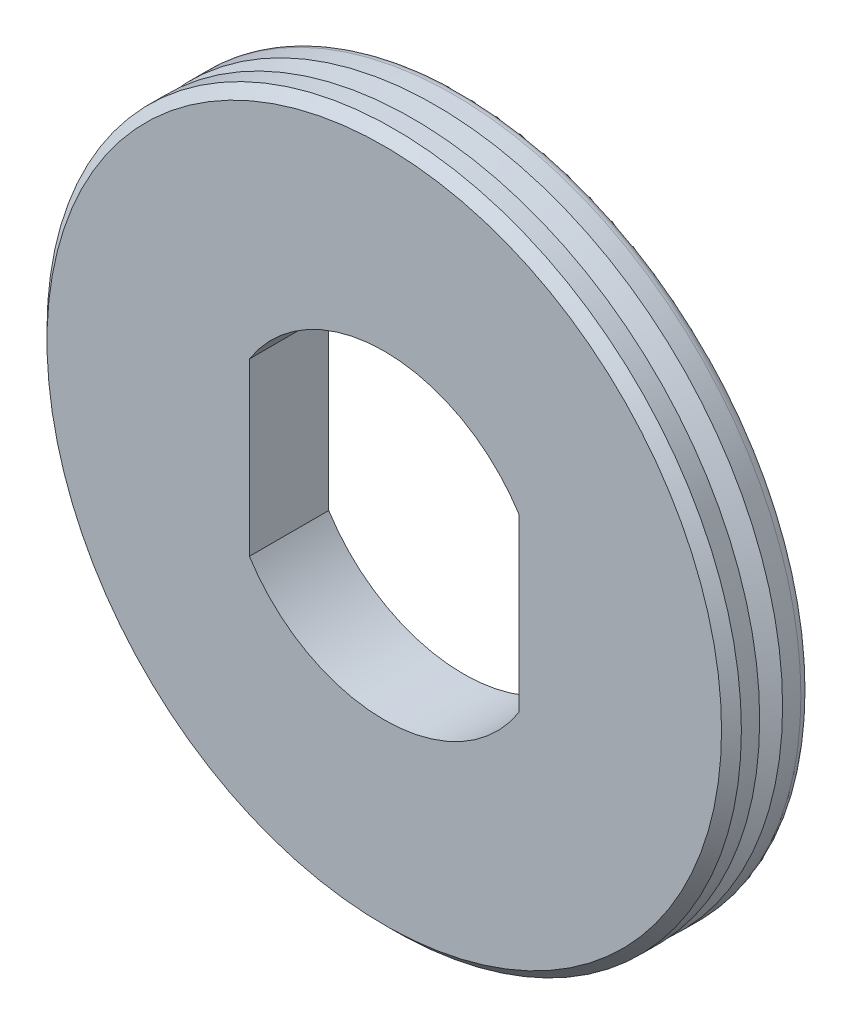
ISO-10303-21;
HEADER;
FILE_DESCRIPTION(('STEP AP214'),'2;1');
FILE_NAME('part.step','',(''),(''),'','','');
FILE_SCHEMA(('AUTOMOTIVE_DESIGN { 1 0 10303 214 1 1 1 1 }'));
ENDSEC;
DATA;
#1=APPLICATION_CONTEXT('core data for automotive mechanical design processes');
#2=APPLICATION_PROTOCOL_DEFINITION('international standard','automotive_design',2000,#1);
#3=PRODUCT_CONTEXT('',#1,'mechanical');
#4=PRODUCT('Part','Part','',(#3));
#5=PRODUCT_RELATED_PRODUCT_CATEGORY('part','',(#4));
#6=PRODUCT_DEFINITION_FORMATION('','',#4);
#7=PRODUCT_DEFINITION_CONTEXT('part definition',#1,'design');
#8=PRODUCT_DEFINITION('design','',#6,#7);
#9=PRODUCT_DEFINITION_SHAPE('','',#8);
#10=(LENGTH_UNIT() NAMED_UNIT(*) SI_UNIT(.MILLI.,.METRE.));
#11=(NAMED_UNIT(*) PLANE_ANGLE_UNIT() SI_UNIT($,.RADIAN.));
#12=(NAMED_UNIT(*) SI_UNIT($,.STERADIAN.) SOLID_ANGLE_UNIT());
#13=UNCERTAINTY_MEASURE_WITH_UNIT(LENGTH_MEASURE(1.E-05),#10,'distance_accuracy_value','');
#14=(GEOMETRIC_REPRESENTATION_CONTEXT(3) GLOBAL_UNCERTAINTY_ASSIGNED_CONTEXT((#13)) GLOBAL_UNIT_ASSIGNED_CONTEXT((#10,
#11,#12)) REPRESENTATION_CONTEXT('',''));
#15=CARTESIAN_POINT('',(0.,0.,0.));
#16=DIRECTION('',(0.,0.,1.));
#17=DIRECTION('',(1.,0.,0.));
#18=AXIS2_PLACEMENT_3D('',#15,#16,#17);
#19=CARTESIAN_POINT('',(0.,0.,2.));
#20=DIRECTION('',(0.,0.,-1.));
#21=DIRECTION('',(-1.,0.,0.));
#22=AXIS2_PLACEMENT_3D('',#19,#20,#21);
#23=CYLINDRICAL_SURFACE('',#22,17.5);
#24=CARTESIAN_POINT('',(0.,0.,1.5));
#25=DIRECTION('',(0.,0.,1.));
#26=DIRECTION('',(1.,0.,0.));
#27=AXIS2_PLACEMENT_3D('',#24,#25,#26);
#28=CIRCLE('',#27,17.5);
#29=CARTESIAN_POINT('',(17.5,0.,1.5));
#30=VERTEX_POINT('',#29);
#31=EDGE_CURVE('E118',#30,#30,#28,.F.);
#32=ORIENTED_EDGE('',*,*,#31,.T.);
#33=EDGE_LOOP('',(#32));
#34=FACE_BOUND('',#33,.T.);
#35=CARTESIAN_POINT('',(0.,0.,0.577350269189624));
#36=DIRECTION('',(0.,0.,1.));
#37=DIRECTION('',(1.,0.,0.));
#38=AXIS2_PLACEMENT_3D('',#35,#36,#37);
#39=CIRCLE('',#38,17.5);
#40=CARTESIAN_POINT('',(17.5,0.,0.577350269189624));
#41=VERTEX_POINT('',#40);
#42=EDGE_CURVE('E106',#41,#41,#39,.T.);
#43=ORIENTED_EDGE('',*,*,#42,.T.);
#44=EDGE_LOOP('',(#43));
#45=FACE_BOUND('',#44,.T.);
#46=ADVANCED_FACE('F36',(#34,#45),#23,.T.);
#47=CARTESIAN_POINT('',(0.,0.,-1.5));
#48=DIRECTION('',(0.,0.,1.));
#49=DIRECTION('',(1.,0.,0.));
#50=AXIS2_PLACEMENT_3D('',#47,#48,#49);
#51=CIRCLE('',#50,17.5);
#52=CARTESIAN_POINT('',(17.5,0.,-1.5));
#53=VERTEX_POINT('',#52);
#54=EDGE_CURVE('E44',#53,#53,#51,.T.);
#55=ORIENTED_EDGE('',*,*,#54,.T.);
#56=EDGE_LOOP('',(#55));
#57=FACE_BOUND('',#56,.T.);
#58=CARTESIAN_POINT('',(0.,0.,-0.577350269189624));
#59=DIRECTION('',(0.,0.,1.));
#60=DIRECTION('',(1.,0.,0.));
#61=AXIS2_PLACEMENT_3D('',#58,#59,#60);
#62=CIRCLE('',#61,17.5);
#63=CARTESIAN_POINT('',(17.5,0.,-0.577350269189624));
#64=VERTEX_POINT('',#63);
#65=EDGE_CURVE('E175',#64,#64,#62,.T.);
#66=ORIENTED_EDGE('',*,*,#65,.F.);
#67=EDGE_LOOP('',(#66));
#68=FACE_BOUND('',#67,.T.);
#69=ADVANCED_FACE('F123',(#57,#68),#23,.T.);
#70=CARTESIAN_POINT('',(0.,0.,2.));
#71=DIRECTION('',(0.,0.,1.));
#72=DIRECTION('',(1.,0.,0.));
#73=AXIS2_PLACEMENT_3D('',#70,#71,#72);
#74=PLANE('',#73);
#75=CARTESIAN_POINT('',(0.,0.,2.));
#76=DIRECTION('',(0.,0.,1.));
#77=DIRECTION('',(1.,0.,0.));
#78=AXIS2_PLACEMENT_3D('',#75,#76,#77);
#79=CIRCLE('',#78,17.);
#80=CARTESIAN_POINT('',(17.,0.,2.));
#81=VERTEX_POINT('',#80);
#82=EDGE_CURVE('E93',#81,#81,#79,.T.);
#83=ORIENTED_EDGE('',*,*,#82,.T.);
#84=EDGE_LOOP('',(#83));
#85=FACE_BOUND('',#84,.T.);
#86=DIRECTION('',(0.,-1.,0.));
#87=VECTOR('',#86,1.);
#88=CARTESIAN_POINT('',(-6.8,4.30842198490352,2.));
#89=LINE('',#88,#87);
#90=CARTESIAN_POINT('',(-6.8,4.30842198490352,2.));
#91=VERTEX_POINT('',#90);
#92=CARTESIAN_POINT('',(-6.8,-4.30842198490352,2.));
#93=VERTEX_POINT('',#92);
#94=EDGE_CURVE('E85',#91,#93,#89,.T.);
#95=ORIENTED_EDGE('',*,*,#94,.F.);
#96=CARTESIAN_POINT('',(0.,0.,2.));
#97=DIRECTION('',(0.,0.,1.));
#98=DIRECTION('',(1.,0.,0.));
#99=AXIS2_PLACEMENT_3D('',#96,#97,#98);
#100=CIRCLE('',#99,8.05);
#101=CARTESIAN_POINT('',(6.8,4.30842198490352,2.));
#102=VERTEX_POINT('',#101);
#103=EDGE_CURVE('E77',#102,#91,#100,.T.);
#104=ORIENTED_EDGE('',*,*,#103,.F.);
#105=DIRECTION('',(0.,1.,0.));
#106=VECTOR('',#105,1.);
#107=CARTESIAN_POINT('',(6.8,4.30842198490352,2.));
#108=LINE('',#107,#106);
#109=CARTESIAN_POINT('',(6.8,-4.30842198490352,2.));
#110=VERTEX_POINT('',#109);
#111=EDGE_CURVE('E100',#110,#102,#108,.T.);
#112=ORIENTED_EDGE('',*,*,#111,.F.);
#113=CARTESIAN_POINT('',(0.,0.,2.));
#114=DIRECTION('',(0.,0.,1.));
#115=DIRECTION('',(1.,0.,0.));
#116=AXIS2_PLACEMENT_3D('',#113,#114,#115);
#117=CIRCLE('',#116,8.05);
#118=EDGE_CURVE('E98',#93,#110,#117,.T.);
#119=ORIENTED_EDGE('',*,*,#118,.F.);
#120=EDGE_LOOP('',(#95,#104,#112,#119));
#121=FACE_BOUND('',#120,.T.);
#122=ADVANCED_FACE('F97',(#85,#121),#74,.T.);
#123=CARTESIAN_POINT('',(0.,0.,-2.));
#124=DIRECTION('',(0.,0.,1.));
#125=DIRECTION('',(1.,0.,0.));
#126=AXIS2_PLACEMENT_3D('',#123,#124,#125);
#127=PLANE('',#126);
#128=CARTESIAN_POINT('',(0.,0.,-2.));
#129=DIRECTION('',(0.,0.,1.));
#130=DIRECTION('',(1.,0.,0.));
#131=AXIS2_PLACEMENT_3D('',#128,#129,#130);
#132=CIRCLE('',#131,17.);
#133=CARTESIAN_POINT('',(17.,0.,-2.));
#134=VERTEX_POINT('',#133);
#135=EDGE_CURVE('E11',#134,#134,#132,.F.);
#136=ORIENTED_EDGE('',*,*,#135,.T.);
#137=EDGE_LOOP('',(#136));
#138=FACE_BOUND('',#137,.T.);
#139=CARTESIAN_POINT('',(0.,0.,-2.));
#140=DIRECTION('',(0.,0.,1.));
#141=DIRECTION('',(1.,0.,0.));
#142=AXIS2_PLACEMENT_3D('',#139,#140,#141);
#143=CIRCLE('',#142,8.05);
#144=CARTESIAN_POINT('',(6.8,4.30842198490352,-2.));
#145=VERTEX_POINT('',#144);
#146=CARTESIAN_POINT('',(-6.8,4.30842198490352,-2.));
#147=VERTEX_POINT('',#146);
#148=EDGE_CURVE('E59',#145,#147,#143,.T.);
#149=ORIENTED_EDGE('',*,*,#148,.T.);
#150=DIRECTION('',(0.,-1.,0.));
#151=VECTOR('',#150,1.);
#152=CARTESIAN_POINT('',(-6.8,4.30842198490352,-2.));
#153=LINE('',#152,#151);
#154=CARTESIAN_POINT('',(-6.8,-4.30842198490352,-2.));
#155=VERTEX_POINT('',#154);
#156=EDGE_CURVE('E92',#147,#155,#153,.T.);
#157=ORIENTED_EDGE('',*,*,#156,.T.);
#158=CARTESIAN_POINT('',(0.,0.,-2.));
#159=DIRECTION('',(0.,0.,1.));
#160=DIRECTION('',(1.,0.,0.));
#161=AXIS2_PLACEMENT_3D('',#158,#159,#160);
#162=CIRCLE('',#161,8.05);
#163=CARTESIAN_POINT('',(6.8,-4.30842198490352,-2.));
#164=VERTEX_POINT('',#163);
#165=EDGE_CURVE('E108',#155,#164,#162,.T.);
#166=ORIENTED_EDGE('',*,*,#165,.T.);
#167=DIRECTION('',(0.,1.,0.));
#168=VECTOR('',#167,1.);
#169=CARTESIAN_POINT('',(6.8,4.30842198490352,-2.));
#170=LINE('',#169,#168);
#171=EDGE_CURVE('E86',#164,#145,#170,.T.);
#172=ORIENTED_EDGE('',*,*,#171,.T.);
#173=EDGE_LOOP('',(#149,#157,#166,#172));
#174=FACE_BOUND('',#173,.T.);
#175=ADVANCED_FACE('F143',(#138,#174),#127,.F.);
#176=CARTESIAN_POINT('',(0.,0.,2.));
#177=DIRECTION('',(0.,0.,-1.));
#178=DIRECTION('',(-1.,0.,0.));
#179=AXIS2_PLACEMENT_3D('',#176,#177,#178);
#180=CYLINDRICAL_SURFACE('',#179,8.05);
#181=ORIENTED_EDGE('',*,*,#148,.F.);
#182=DIRECTION('',(0.,0.,-1.));
#183=VECTOR('',#182,1.);
#184=CARTESIAN_POINT('',(6.8,4.30842198490352,2.));
#185=LINE('',#184,#183);
#186=EDGE_CURVE('E81',#102,#145,#185,.T.);
#187=ORIENTED_EDGE('',*,*,#186,.F.);
#188=ORIENTED_EDGE('',*,*,#103,.T.);
#189=DIRECTION('',(0.,0.,-1.));
#190=VECTOR('',#189,1.);
#191=CARTESIAN_POINT('',(-6.8,4.30842198490352,2.));
#192=LINE('',#191,#190);
#193=EDGE_CURVE('E80',#91,#147,#192,.T.);
#194=ORIENTED_EDGE('',*,*,#193,.T.);
#195=EDGE_LOOP('',(#181,#187,#188,#194));
#196=FACE_BOUND('',#195,.T.);
#197=ADVANCED_FACE('F79',(#196),#180,.F.);
#198=CARTESIAN_POINT('',(-6.8,4.30842198490352,2.));
#199=DIRECTION('',(1.,0.,0.));
#200=DIRECTION('',(0.,1.,0.));
#201=AXIS2_PLACEMENT_3D('',#198,#199,#200);
#202=PLANE('',#201);
#203=ORIENTED_EDGE('',*,*,#156,.F.);
#204=ORIENTED_EDGE('',*,*,#193,.F.);
#205=ORIENTED_EDGE('',*,*,#94,.T.);
#206=DIRECTION('',(0.,0.,-1.));
#207=VECTOR('',#206,1.);
#208=CARTESIAN_POINT('',(-6.8,-4.30842198490352,2.));
#209=LINE('',#208,#207);
#210=EDGE_CURVE('E94',#93,#155,#209,.T.);
#211=ORIENTED_EDGE('',*,*,#210,.T.);
#212=EDGE_LOOP('',(#203,#204,#205,#211));
#213=FACE_BOUND('',#212,.T.);
#214=ADVANCED_FACE('F89',(#213),#202,.T.);
#215=CARTESIAN_POINT('',(0.,0.,2.));
#216=DIRECTION('',(0.,0.,-1.));
#217=DIRECTION('',(-1.,0.,0.));
#218=AXIS2_PLACEMENT_3D('',#215,#216,#217);
#219=CYLINDRICAL_SURFACE('',#218,8.05);
#220=ORIENTED_EDGE('',*,*,#165,.F.);
#221=ORIENTED_EDGE('',*,*,#210,.F.);
#222=ORIENTED_EDGE('',*,*,#118,.T.);
#223=DIRECTION('',(0.,0.,-1.));
#224=VECTOR('',#223,1.);
#225=CARTESIAN_POINT('',(6.8,-4.30842198490352,2.));
#226=LINE('',#225,#224);
#227=EDGE_CURVE('E51',#110,#164,#226,.T.);
#228=ORIENTED_EDGE('',*,*,#227,.T.);
#229=EDGE_LOOP('',(#220,#221,#222,#228));
#230=FACE_BOUND('',#229,.T.);
#231=ADVANCED_FACE('F157',(#230),#219,.F.);
#232=CARTESIAN_POINT('',(6.8,4.30842198490352,2.));
#233=DIRECTION('',(-1.,0.,0.));
#234=DIRECTION('',(0.,0.,1.));
#235=AXIS2_PLACEMENT_3D('',#232,#233,#234);
#236=PLANE('',#235);
#237=ORIENTED_EDGE('',*,*,#171,.F.);
#238=ORIENTED_EDGE('',*,*,#227,.F.);
#239=ORIENTED_EDGE('',*,*,#111,.T.);
#240=ORIENTED_EDGE('',*,*,#186,.T.);
#241=EDGE_LOOP('',(#237,#238,#239,#240));
#242=FACE_BOUND('',#241,.T.);
#243=ADVANCED_FACE('F160',(#242),#236,.T.);
#244=CARTESIAN_POINT('',(0.,0.,0.577350269189624));
#245=DIRECTION('',(0.,0.,1.));
#246=DIRECTION('',(1.,0.,0.));
#247=AXIS2_PLACEMENT_3D('',#244,#245,#246);
#248=CONICAL_SURFACE('',#247,17.5,1.0471975511966);
#249=CARTESIAN_POINT('',(0.,0.,0.));
#250=DIRECTION('',(0.,0.,1.));
#251=DIRECTION('',(1.,0.,0.));
#252=AXIS2_PLACEMENT_3D('',#249,#250,#251);
#253=CIRCLE('',#252,16.5);
#254=CARTESIAN_POINT('',(16.5,0.,0.));
#255=VERTEX_POINT('',#254);
#256=EDGE_CURVE('E178',#255,#255,#253,.T.);
#257=ORIENTED_EDGE('',*,*,#256,.T.);
#258=EDGE_LOOP('',(#257));
#259=FACE_BOUND('',#258,.T.);
#260=ORIENTED_EDGE('',*,*,#42,.F.);
#261=EDGE_LOOP('',(#260));
#262=FACE_BOUND('',#261,.T.);
#263=ADVANCED_FACE('F164',(#259,#262),#248,.T.);
#264=CARTESIAN_POINT('',(0.,0.,0.));
#265=DIRECTION('',(0.,0.,-1.));
#266=DIRECTION('',(-1.,0.,0.));
#267=AXIS2_PLACEMENT_3D('',#264,#265,#266);
#268=CONICAL_SURFACE('',#267,16.5,1.0471975511966);
#269=ORIENTED_EDGE('',*,*,#65,.T.);
#270=EDGE_LOOP('',(#269));
#271=FACE_BOUND('',#270,.T.);
#272=ORIENTED_EDGE('',*,*,#256,.F.);
#273=EDGE_LOOP('',(#272));
#274=FACE_BOUND('',#273,.T.);
#275=ADVANCED_FACE('F132',(#271,#274),#268,.T.);
#276=CARTESIAN_POINT('',(0.,0.,2.));
#277=DIRECTION('',(0.,0.,-1.));
#278=DIRECTION('',(-1.,0.,0.));
#279=AXIS2_PLACEMENT_3D('',#276,#277,#278);
#280=CONICAL_SURFACE('',#279,17.,0.785398163397448);
#281=ORIENTED_EDGE('',*,*,#31,.F.);
#282=EDGE_LOOP('',(#281));
#283=FACE_BOUND('',#282,.T.);
#284=ORIENTED_EDGE('',*,*,#82,.F.);
#285=EDGE_LOOP('',(#284));
#286=FACE_BOUND('',#285,.T.);
#287=ADVANCED_FACE('F127',(#283,#286),#280,.T.);
#288=CARTESIAN_POINT('',(0.,0.,-1.5));
#289=DIRECTION('',(0.,0.,1.));
#290=DIRECTION('',(1.,0.,0.));
#291=AXIS2_PLACEMENT_3D('',#288,#289,#290);
#292=TOROIDAL_SURFACE('',#291,17.,0.5);
#293=ORIENTED_EDGE('',*,*,#135,.F.);
#294=EDGE_LOOP('',(#293));
#295=FACE_BOUND('',#294,.T.);
#296=ORIENTED_EDGE('',*,*,#54,.F.);
#297=EDGE_LOOP('',(#296));
#298=FACE_BOUND('',#297,.T.);
#299=ADVANCED_FACE('F38',(#295,#298),#292,.T.);
#300=CLOSED_SHELL('',(#46,#69,#122,#175,#197,#214,#231,#243,#263,#275,#287,#299));
#301=MANIFOLD_SOLID_BREP('B2',#300);
#302=ADVANCED_BREP_SHAPE_REPRESENTATION('',(#18,#301),#14);
#303=SHAPE_DEFINITION_REPRESENTATION(#9,#302);
ENDSEC;
END-ISO-10303-21;
